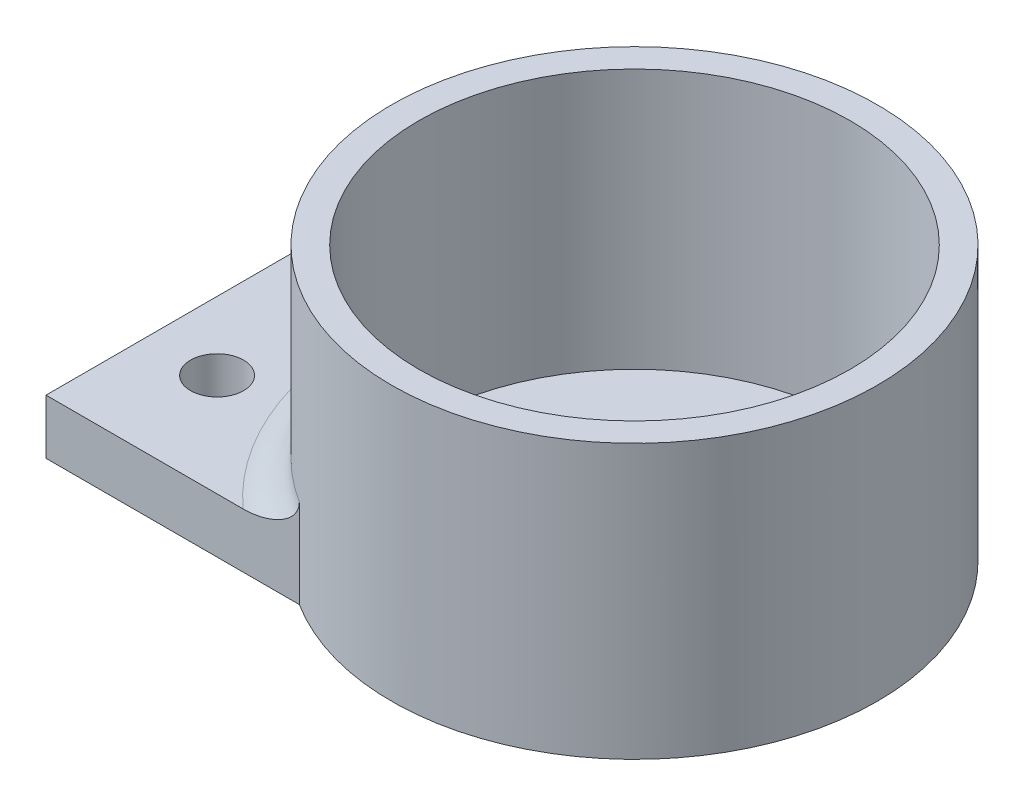
ISO-10303-21;
HEADER;
FILE_DESCRIPTION(('STEP AP214'),'2;1');
FILE_NAME('part.step','',(''),(''),'','','');
FILE_SCHEMA(('AUTOMOTIVE_DESIGN { 1 0 10303 214 1 1 1 1 }'));
ENDSEC;
DATA;
#1=APPLICATION_CONTEXT('core data for automotive mechanical design processes');
#2=APPLICATION_PROTOCOL_DEFINITION('international standard','automotive_design',2000,#1);
#3=PRODUCT_CONTEXT('',#1,'mechanical');
#4=PRODUCT('Part','Part','',(#3));
#5=PRODUCT_RELATED_PRODUCT_CATEGORY('part','',(#4));
#6=PRODUCT_DEFINITION_FORMATION('','',#4);
#7=PRODUCT_DEFINITION_CONTEXT('part definition',#1,'design');
#8=PRODUCT_DEFINITION('design','',#6,#7);
#9=PRODUCT_DEFINITION_SHAPE('','',#8);
#10=(LENGTH_UNIT() NAMED_UNIT(*) SI_UNIT(.MILLI.,.METRE.));
#11=(NAMED_UNIT(*) PLANE_ANGLE_UNIT() SI_UNIT($,.RADIAN.));
#12=(NAMED_UNIT(*) SI_UNIT($,.STERADIAN.) SOLID_ANGLE_UNIT());
#13=UNCERTAINTY_MEASURE_WITH_UNIT(LENGTH_MEASURE(1.E-05),#10,'distance_accuracy_value','');
#14=(GEOMETRIC_REPRESENTATION_CONTEXT(3) GLOBAL_UNCERTAINTY_ASSIGNED_CONTEXT((#13)) GLOBAL_UNIT_ASSIGNED_CONTEXT((#10,
#11,#12)) REPRESENTATION_CONTEXT('',''));
#15=CARTESIAN_POINT('',(0.,0.,0.));
#16=DIRECTION('',(0.,0.,1.));
#17=DIRECTION('',(1.,0.,0.));
#18=AXIS2_PLACEMENT_3D('',#15,#16,#17);
#19=CARTESIAN_POINT('',(0.,16.,0.));
#20=DIRECTION('',(0.,-1.,0.));
#21=DIRECTION('',(0.,0.,-1.));
#22=AXIS2_PLACEMENT_3D('',#19,#20,#21);
#23=CYLINDRICAL_SURFACE('',#22,12.6);
#24=CARTESIAN_POINT('',(0.,16.,0.));
#25=DIRECTION('',(0.,1.,0.));
#26=DIRECTION('',(0.,0.,1.));
#27=AXIS2_PLACEMENT_3D('',#24,#25,#26);
#28=CIRCLE('',#27,12.6);
#29=CARTESIAN_POINT('',(0.,16.,12.6));
#30=VERTEX_POINT('',#29);
#31=EDGE_CURVE('E124',#30,#30,#28,.T.);
#32=ORIENTED_EDGE('',*,*,#31,.T.);
#33=EDGE_LOOP('',(#32));
#34=FACE_BOUND('',#33,.T.);
#35=CARTESIAN_POINT('',(0.,0.8,0.));
#36=DIRECTION('',(0.,-1.,0.));
#37=DIRECTION('',(0.,0.,-1.));
#38=AXIS2_PLACEMENT_3D('',#35,#36,#37);
#39=CIRCLE('',#38,12.6);
#40=CARTESIAN_POINT('',(0.,0.8,-12.6));
#41=VERTEX_POINT('',#40);
#42=EDGE_CURVE('E175',#41,#41,#39,.T.);
#43=ORIENTED_EDGE('',*,*,#42,.T.);
#44=EDGE_LOOP('',(#43));
#45=FACE_BOUND('',#44,.T.);
#46=ADVANCED_FACE('F35',(#34,#45),#23,.F.);
#47=CARTESIAN_POINT('',(0.,16.,0.));
#48=DIRECTION('',(0.,-1.,0.));
#49=DIRECTION('',(0.,0.,-1.));
#50=AXIS2_PLACEMENT_3D('',#47,#48,#49);
#51=CYLINDRICAL_SURFACE('',#50,14.2);
#52=CARTESIAN_POINT('',(0.,16.,0.));
#53=DIRECTION('',(0.,1.,0.));
#54=DIRECTION('',(0.,0.,1.));
#55=AXIS2_PLACEMENT_3D('',#52,#53,#54);
#56=CIRCLE('',#55,14.2);
#57=CARTESIAN_POINT('',(0.,16.,14.2));
#58=VERTEX_POINT('',#57);
#59=EDGE_CURVE('E130',#58,#58,#56,.T.);
#60=ORIENTED_EDGE('',*,*,#59,.F.);
#61=EDGE_LOOP('',(#60));
#62=FACE_BOUND('',#61,.T.);
#63=DIRECTION('',(0.,-1.,0.));
#64=VECTOR('',#63,1.);
#65=CARTESIAN_POINT('',(-7.59210115844093,3.2,-12.));
#66=LINE('',#65,#64);
#67=CARTESIAN_POINT('',(-7.59210115844093,5.2,-12.));
#68=VERTEX_POINT('',#67);
#69=CARTESIAN_POINT('',(-7.59210115844093,0.,-12.));
#70=VERTEX_POINT('',#69);
#71=EDGE_CURVE('E55',#68,#70,#66,.T.);
#72=ORIENTED_EDGE('',*,*,#71,.F.);
#73=CARTESIAN_POINT('',(0.,5.2,0.));
#74=DIRECTION('',(0.,-1.,0.));
#75=DIRECTION('',(0.,0.,-1.));
#76=AXIS2_PLACEMENT_3D('',#73,#74,#75);
#77=CIRCLE('',#76,14.2);
#78=CARTESIAN_POINT('',(-7.59210115844093,5.2,12.));
#79=VERTEX_POINT('',#78);
#80=EDGE_CURVE('E141',#68,#79,#77,.F.);
#81=ORIENTED_EDGE('',*,*,#80,.T.);
#82=DIRECTION('',(0.,-1.,0.));
#83=VECTOR('',#82,1.);
#84=CARTESIAN_POINT('',(-7.59210115844093,3.2,12.));
#85=LINE('',#84,#83);
#86=CARTESIAN_POINT('',(-7.59210115844093,0.,12.));
#87=VERTEX_POINT('',#86);
#88=EDGE_CURVE('E62',#79,#87,#85,.T.);
#89=ORIENTED_EDGE('',*,*,#88,.T.);
#90=CARTESIAN_POINT('',(0.,0.,0.));
#91=DIRECTION('',(0.,1.,0.));
#92=DIRECTION('',(0.,0.,1.));
#93=AXIS2_PLACEMENT_3D('',#90,#91,#92);
#94=CIRCLE('',#93,14.2);
#95=EDGE_CURVE('E129',#87,#70,#94,.T.);
#96=ORIENTED_EDGE('',*,*,#95,.T.);
#97=EDGE_LOOP('',(#72,#81,#89,#96));
#98=FACE_BOUND('',#97,.T.);
#99=ADVANCED_FACE('F157',(#62,#98),#51,.T.);
#100=CARTESIAN_POINT('',(0.,16.,0.));
#101=DIRECTION('',(0.,1.,0.));
#102=DIRECTION('',(0.,0.,1.));
#103=AXIS2_PLACEMENT_3D('',#100,#101,#102);
#104=PLANE('',#103);
#105=ORIENTED_EDGE('',*,*,#59,.T.);
#106=EDGE_LOOP('',(#105));
#107=FACE_BOUND('',#106,.T.);
#108=ORIENTED_EDGE('',*,*,#31,.F.);
#109=EDGE_LOOP('',(#108));
#110=FACE_BOUND('',#109,.T.);
#111=ADVANCED_FACE('F159',(#107,#110),#104,.T.);
#112=CARTESIAN_POINT('',(0.,0.,0.));
#113=DIRECTION('',(0.,1.,0.));
#114=DIRECTION('',(0.,0.,1.));
#115=AXIS2_PLACEMENT_3D('',#112,#113,#114);
#116=PLANE('',#115);
#117=CARTESIAN_POINT('',(-18.4,0.,6.));
#118=DIRECTION('',(0.,-1.,0.));
#119=DIRECTION('',(0.,0.,-1.));
#120=AXIS2_PLACEMENT_3D('',#117,#118,#119);
#121=CIRCLE('',#120,1.55);
#122=CARTESIAN_POINT('',(-18.4,0.,4.45));
#123=VERTEX_POINT('',#122);
#124=EDGE_CURVE('E139',#123,#123,#121,.T.);
#125=ORIENTED_EDGE('',*,*,#124,.F.);
#126=EDGE_LOOP('',(#125));
#127=FACE_BOUND('',#126,.T.);
#128=CARTESIAN_POINT('',(-18.4,0.,-6.));
#129=DIRECTION('',(0.,-1.,0.));
#130=DIRECTION('',(0.,0.,-1.));
#131=AXIS2_PLACEMENT_3D('',#128,#129,#130);
#132=CIRCLE('',#131,1.55);
#133=CARTESIAN_POINT('',(-18.4,0.,-7.55));
#134=VERTEX_POINT('',#133);
#135=EDGE_CURVE('E115',#134,#134,#132,.T.);
#136=ORIENTED_EDGE('',*,*,#135,.F.);
#137=EDGE_LOOP('',(#136));
#138=FACE_BOUND('',#137,.T.);
#139=ORIENTED_EDGE('',*,*,#95,.F.);
#140=DIRECTION('',(1.,0.,0.));
#141=VECTOR('',#140,1.);
#142=CARTESIAN_POINT('',(0.,0.,12.));
#143=LINE('',#142,#141);
#144=CARTESIAN_POINT('',(-22.4,0.,12.));
#145=VERTEX_POINT('',#144);
#146=EDGE_CURVE('E111',#145,#87,#143,.T.);
#147=ORIENTED_EDGE('',*,*,#146,.F.);
#148=DIRECTION('',(0.,0.,-1.));
#149=VECTOR('',#148,1.);
#150=CARTESIAN_POINT('',(-22.4,0.,0.));
#151=LINE('',#150,#149);
#152=CARTESIAN_POINT('',(-22.4,0.,-12.));
#153=VERTEX_POINT('',#152);
#154=EDGE_CURVE('E119',#145,#153,#151,.T.);
#155=ORIENTED_EDGE('',*,*,#154,.T.);
#156=DIRECTION('',(1.,0.,0.));
#157=VECTOR('',#156,1.);
#158=CARTESIAN_POINT('',(0.,0.,-12.));
#159=LINE('',#158,#157);
#160=EDGE_CURVE('E92',#153,#70,#159,.T.);
#161=ORIENTED_EDGE('',*,*,#160,.T.);
#162=EDGE_LOOP('',(#139,#147,#155,#161));
#163=FACE_BOUND('',#162,.T.);
#164=CARTESIAN_POINT('',(0.,0.,0.));
#165=DIRECTION('',(0.,-1.,0.));
#166=DIRECTION('',(0.,0.,-1.));
#167=AXIS2_PLACEMENT_3D('',#164,#165,#166);
#168=CIRCLE('',#167,3.8);
#169=CARTESIAN_POINT('',(0.,0.,-3.8));
#170=VERTEX_POINT('',#169);
#171=EDGE_CURVE('E181',#170,#170,#168,.T.);
#172=ORIENTED_EDGE('',*,*,#171,.F.);
#173=EDGE_LOOP('',(#172));
#174=FACE_BOUND('',#173,.T.);
#175=ADVANCED_FACE('F154',(#127,#138,#163,#174),#116,.F.);
#176=CARTESIAN_POINT('',(-22.4,3.2,0.));
#177=DIRECTION('',(-1.,0.,0.));
#178=DIRECTION('',(0.,0.,1.));
#179=AXIS2_PLACEMENT_3D('',#176,#177,#178);
#180=PLANE('',#179);
#181=ORIENTED_EDGE('',*,*,#154,.F.);
#182=DIRECTION('',(0.,-1.,0.));
#183=VECTOR('',#182,1.);
#184=CARTESIAN_POINT('',(-22.4,3.2,12.));
#185=LINE('',#184,#183);
#186=CARTESIAN_POINT('',(-22.4,3.2,12.));
#187=VERTEX_POINT('',#186);
#188=EDGE_CURVE('E109',#187,#145,#185,.T.);
#189=ORIENTED_EDGE('',*,*,#188,.F.);
#190=DIRECTION('',(0.,0.,-1.));
#191=VECTOR('',#190,1.);
#192=CARTESIAN_POINT('',(-22.4,3.2,0.));
#193=LINE('',#192,#191);
#194=CARTESIAN_POINT('',(-22.4,3.2,-12.));
#195=VERTEX_POINT('',#194);
#196=EDGE_CURVE('E104',#187,#195,#193,.T.);
#197=ORIENTED_EDGE('',*,*,#196,.T.);
#198=DIRECTION('',(0.,-1.,0.));
#199=VECTOR('',#198,1.);
#200=CARTESIAN_POINT('',(-22.4,3.2,-12.));
#201=LINE('',#200,#199);
#202=EDGE_CURVE('E87',#195,#153,#201,.T.);
#203=ORIENTED_EDGE('',*,*,#202,.T.);
#204=EDGE_LOOP('',(#181,#189,#197,#203));
#205=FACE_BOUND('',#204,.T.);
#206=ADVANCED_FACE('F108',(#205),#180,.T.);
#207=CARTESIAN_POINT('',(0.,3.2,12.));
#208=DIRECTION('',(0.,0.,-1.));
#209=DIRECTION('',(-1.,0.,0.));
#210=AXIS2_PLACEMENT_3D('',#207,#208,#209);
#211=PLANE('',#210);
#212=ORIENTED_EDGE('',*,*,#146,.T.);
#213=ORIENTED_EDGE('',*,*,#88,.F.);
#214=CARTESIAN_POINT('',(-7.59210115844093,5.2,12.));
#215=CARTESIAN_POINT('',(-7.592091586476,5.1674907517451,12.));
#216=CARTESIAN_POINT('',(-7.59358472526516,5.1349990568144,12.));
#217=CARTESIAN_POINT('',(-7.59948236105787,5.07031610765808,12.));
#218=CARTESIAN_POINT('',(-7.60388364184017,5.03812456132676,12.));
#219=CARTESIAN_POINT('',(-7.62117971545354,4.94302771261602,12.));
#220=CARTESIAN_POINT('',(-7.63817153133713,4.88083921766464,12.));
#221=CARTESIAN_POINT('',(-7.68704338768166,4.74478440607469,12.));
#222=CARTESIAN_POINT('',(-7.72158651420703,4.67189460870396,12.));
#223=CARTESIAN_POINT('',(-7.80200128612696,4.53240676871077,12.));
#224=CARTESIAN_POINT('',(-7.84792617011265,4.46584038828011,12.));
#225=CARTESIAN_POINT('',(-7.97592011352488,4.30396090733096,12.));
#226=CARTESIAN_POINT('',(-8.06385833641699,4.21333330304286,12.));
#227=CARTESIAN_POINT('',(-8.25214358590425,4.04619954543277,12.));
#228=CARTESIAN_POINT('',(-8.35251701096455,3.96972432419483,12.));
#229=CARTESIAN_POINT('',(-8.54502554617771,3.8401884859509,12.));
#230=CARTESIAN_POINT('',(-8.63597537511568,3.78533693476471,12.));
#231=CARTESIAN_POINT('',(-8.82225966456421,3.68357238123239,12.));
#232=CARTESIAN_POINT('',(-8.91759695939213,3.63666460480407,12.));
#233=CARTESIAN_POINT('',(-9.1117120035958,3.55021476207558,12.));
#234=CARTESIAN_POINT('',(-9.21049491643555,3.5106843682619,12.));
#235=CARTESIAN_POINT('',(-9.4106253428973,3.4387497702227,12.));
#236=CARTESIAN_POINT('',(-9.51197317193242,3.40634644722275,12.));
#237=CARTESIAN_POINT('',(-9.71774595834552,3.34820839586359,12.));
#238=CARTESIAN_POINT('',(-9.82219235814489,3.32254972319131,12.));
#239=CARTESIAN_POINT('',(-10.0325812364247,3.27836302791032,12.));
#240=CARTESIAN_POINT('',(-10.1385237177011,3.25983501862917,12.));
#241=CARTESIAN_POINT('',(-10.3506319126569,3.2301374043945,12.));
#242=CARTESIAN_POINT('',(-10.4567900334942,3.21891381269759,12.));
#243=CARTESIAN_POINT('',(-10.6696307826768,3.20385383900649,12.));
#244=CARTESIAN_POINT('',(-10.7763134318927,3.20001775338188,12.));
#245=CARTESIAN_POINT('',(-10.8830142883302,3.2,12.));
#246=B_SPLINE_CURVE_WITH_KNOTS('',3,(#214,#215,#216,#217,#218,#219,#220,#221,#222,#223,#224,
#225,#226,#227,#228,#229,#230,#231,#232,#233,#234,#235,#236,#237,#238,#239,#240,#241,#242,#243,
#244,#245),.UNSPECIFIED.,.F.,.F.,(4,2,2,2,2,2,2,2,2,2,2,2,2,2,2,4),(0.,0.097461196912407,
0.194814787905074,0.38727189518514,0.627934270707473,0.869744332528464,1.24648330210409,
1.62403620743147,1.94223889219939,2.26065010442246,2.57956091280387,2.89851113072388,
3.22091706191048,3.54332359568632,3.86331932405566,4.18332788964261),.UNSPECIFIED.);
#247=CARTESIAN_POINT('',(-10.8830142883302,3.2,12.));
#248=VERTEX_POINT('',#247);
#249=EDGE_CURVE('E11',#79,#248,#246,.T.);
#250=ORIENTED_EDGE('',*,*,#249,.T.);
#251=DIRECTION('',(1.,0.,0.));
#252=VECTOR('',#251,1.);
#253=CARTESIAN_POINT('',(0.,3.2,12.));
#254=LINE('',#253,#252);
#255=EDGE_CURVE('E97',#187,#248,#254,.T.);
#256=ORIENTED_EDGE('',*,*,#255,.F.);
#257=ORIENTED_EDGE('',*,*,#188,.T.);
#258=EDGE_LOOP('',(#212,#213,#250,#256,#257));
#259=FACE_BOUND('',#258,.T.);
#260=ADVANCED_FACE('F149',(#259),#211,.F.);
#261=CARTESIAN_POINT('',(0.,3.2,-12.));
#262=DIRECTION('',(0.,0.,-1.));
#263=DIRECTION('',(-1.,0.,0.));
#264=AXIS2_PLACEMENT_3D('',#261,#262,#263);
#265=PLANE('',#264);
#266=ORIENTED_EDGE('',*,*,#160,.F.);
#267=ORIENTED_EDGE('',*,*,#202,.F.);
#268=DIRECTION('',(1.,0.,0.));
#269=VECTOR('',#268,1.);
#270=CARTESIAN_POINT('',(0.,3.2,-12.));
#271=LINE('',#270,#269);
#272=CARTESIAN_POINT('',(-10.8830142883302,3.2,-12.));
#273=VERTEX_POINT('',#272);
#274=EDGE_CURVE('E90',#195,#273,#271,.T.);
#275=ORIENTED_EDGE('',*,*,#274,.T.);
#276=CARTESIAN_POINT('',(-10.8830142883302,3.2,-12.));
#277=CARTESIAN_POINT('',(-10.7528857031162,3.20003980854857,-12.));
#278=CARTESIAN_POINT('',(-10.622790420267,3.20573228934252,-12.));
#279=CARTESIAN_POINT('',(-10.3634686350885,3.22802964705193,-12.));
#280=CARTESIAN_POINT('',(-10.2342425968111,3.24463994747906,-12.));
#281=CARTESIAN_POINT('',(-9.97623712132293,3.28861016920733,-12.));
#282=CARTESIAN_POINT('',(-9.84747681934114,3.31608178258652,-12.));
#283=CARTESIAN_POINT('',(-9.59272267504356,3.38166956867727,-12.));
#284=CARTESIAN_POINT('',(-9.46672785183967,3.41978189920605,-12.));
#285=CARTESIAN_POINT('',(-9.25547354959596,3.49391017042378,-12.));
#286=CARTESIAN_POINT('',(-9.16924274434022,3.52717894722871,-12.));
#287=CARTESIAN_POINT('',(-8.99914195760728,3.59927152159044,-12.));
#288=CARTESIAN_POINT('',(-8.91527146046996,3.63809409434757,-12.));
#289=CARTESIAN_POINT('',(-8.75075067453522,3.7214755531616,-12.));
#290=CARTESIAN_POINT('',(-8.67009098008453,3.76601577503318,-12.));
#291=CARTESIAN_POINT('',(-8.51259315097185,3.86135629845671,-12.));
#292=CARTESIAN_POINT('',(-8.43575299449151,3.91215323749149,-12.));
#293=CARTESIAN_POINT('',(-8.27646095677758,4.02835621385637,-12.));
#294=CARTESIAN_POINT('',(-8.1947643504757,4.09481250303222,-12.));
#295=CARTESIAN_POINT('',(-8.04061278769122,4.23788734401878,-12.));
#296=CARTESIAN_POINT('',(-7.96815398407959,4.31450163818133,-12.));
#297=CARTESIAN_POINT('',(-7.85325803770196,4.45860061221691,-12.));
#298=CARTESIAN_POINT('',(-7.8078255985535,4.52366905987423,-12.));
#299=CARTESIAN_POINT('',(-7.72780547552511,4.65994291743418,-12.));
#300=CARTESIAN_POINT('',(-7.69317070636513,4.73111990566161,-12.));
#301=CARTESIAN_POINT('',(-7.64208134415011,4.86767456055213,-12.));
#302=CARTESIAN_POINT('',(-7.62366907675984,4.93230058487382,-12.));
#303=CARTESIAN_POINT('',(-7.60490424581767,5.03127142153448,-12.));
#304=CARTESIAN_POINT('',(-7.60012342714198,5.06480862795305,-12.));
#305=CARTESIAN_POINT('',(-7.59371435100395,5.13222345127305,-12.));
#306=CARTESIAN_POINT('',(-7.59208999273108,5.16610143730628,-12.));
#307=CARTESIAN_POINT('',(-7.59210115844092,5.2,-12.));
#308=B_SPLINE_CURVE_WITH_KNOTS('',3,(#276,#277,#278,#279,#280,#281,#282,#283,#284,#285,#286,
#287,#288,#289,#290,#291,#292,#293,#294,#295,#296,#297,#298,#299,#300,#301,#302,#303,#304,#305,
#306,#307),.UNSPECIFIED.,.F.,.F.,(4,2,2,2,2,2,2,2,2,2,2,2,2,2,2,4),(0.,0.390217728880545,
0.7806294480965,1.1751649796666,1.56955823497314,1.84666434103392,2.12370942977431,
2.39987212052893,2.67588703683665,2.99114260045318,3.30626644244524,3.54358668553246,
3.77985708576338,3.98038400597982,4.08187782517218,4.18349694062465),.UNSPECIFIED.);
#309=EDGE_CURVE('E48',#273,#68,#308,.T.);
#310=ORIENTED_EDGE('',*,*,#309,.T.);
#311=ORIENTED_EDGE('',*,*,#71,.T.);
#312=EDGE_LOOP('',(#266,#267,#275,#310,#311));
#313=FACE_BOUND('',#312,.T.);
#314=ADVANCED_FACE('F89',(#313),#265,.T.);
#315=CARTESIAN_POINT('',(0.,3.2,0.));
#316=DIRECTION('',(0.,-1.,0.));
#317=DIRECTION('',(0.,0.,-1.));
#318=AXIS2_PLACEMENT_3D('',#315,#316,#317);
#319=PLANE('',#318);
#320=CARTESIAN_POINT('',(-18.4,3.2,6.));
#321=DIRECTION('',(0.,-1.,0.));
#322=DIRECTION('',(0.,0.,-1.));
#323=AXIS2_PLACEMENT_3D('',#320,#321,#322);
#324=CIRCLE('',#323,1.55);
#325=CARTESIAN_POINT('',(-18.4,3.2,4.45));
#326=VERTEX_POINT('',#325);
#327=EDGE_CURVE('E136',#326,#326,#324,.T.);
#328=ORIENTED_EDGE('',*,*,#327,.T.);
#329=EDGE_LOOP('',(#328));
#330=FACE_BOUND('',#329,.T.);
#331=CARTESIAN_POINT('',(-18.4,3.2,-6.));
#332=DIRECTION('',(0.,-1.,0.));
#333=DIRECTION('',(0.,0.,-1.));
#334=AXIS2_PLACEMENT_3D('',#331,#332,#333);
#335=CIRCLE('',#334,1.55);
#336=CARTESIAN_POINT('',(-18.4,3.2,-7.55));
#337=VERTEX_POINT('',#336);
#338=EDGE_CURVE('E121',#337,#337,#335,.T.);
#339=ORIENTED_EDGE('',*,*,#338,.T.);
#340=EDGE_LOOP('',(#339));
#341=FACE_BOUND('',#340,.T.);
#342=ORIENTED_EDGE('',*,*,#255,.T.);
#343=CARTESIAN_POINT('',(0.,3.2,0.));
#344=DIRECTION('',(0.,-1.,0.));
#345=DIRECTION('',(0.,0.,-1.));
#346=AXIS2_PLACEMENT_3D('',#343,#344,#345);
#347=CIRCLE('',#346,16.2);
#348=EDGE_CURVE('E106',#248,#273,#347,.T.);
#349=ORIENTED_EDGE('',*,*,#348,.T.);
#350=ORIENTED_EDGE('',*,*,#274,.F.);
#351=ORIENTED_EDGE('',*,*,#196,.F.);
#352=EDGE_LOOP('',(#342,#349,#350,#351));
#353=FACE_BOUND('',#352,.T.);
#354=ADVANCED_FACE('F103',(#330,#341,#353),#319,.F.);
#355=CARTESIAN_POINT('',(-18.4,10.,-6.));
#356=DIRECTION('',(0.,-1.,0.));
#357=DIRECTION('',(0.,0.,-1.));
#358=AXIS2_PLACEMENT_3D('',#355,#356,#357);
#359=CYLINDRICAL_SURFACE('',#358,1.55);
#360=ORIENTED_EDGE('',*,*,#135,.T.);
#361=EDGE_LOOP('',(#360));
#362=FACE_BOUND('',#361,.T.);
#363=ORIENTED_EDGE('',*,*,#338,.F.);
#364=EDGE_LOOP('',(#363));
#365=FACE_BOUND('',#364,.T.);
#366=ADVANCED_FACE('F203',(#362,#365),#359,.F.);
#367=CARTESIAN_POINT('',(-18.4,10.,6.));
#368=DIRECTION('',(0.,-1.,0.));
#369=DIRECTION('',(0.,0.,-1.));
#370=AXIS2_PLACEMENT_3D('',#367,#368,#369);
#371=CYLINDRICAL_SURFACE('',#370,1.55);
#372=ORIENTED_EDGE('',*,*,#124,.T.);
#373=EDGE_LOOP('',(#372));
#374=FACE_BOUND('',#373,.T.);
#375=ORIENTED_EDGE('',*,*,#327,.F.);
#376=EDGE_LOOP('',(#375));
#377=FACE_BOUND('',#376,.T.);
#378=ADVANCED_FACE('F200',(#374,#377),#371,.F.);
#379=CARTESIAN_POINT('',(0.,5.2,0.));
#380=DIRECTION('',(0.,-1.,0.));
#381=DIRECTION('',(0.,0.,-1.));
#382=AXIS2_PLACEMENT_3D('',#379,#380,#381);
#383=TOROIDAL_SURFACE('',#382,16.2,2.);
#384=ORIENTED_EDGE('',*,*,#249,.F.);
#385=ORIENTED_EDGE('',*,*,#80,.F.);
#386=ORIENTED_EDGE('',*,*,#309,.F.);
#387=ORIENTED_EDGE('',*,*,#348,.F.);
#388=EDGE_LOOP('',(#384,#385,#386,#387));
#389=FACE_BOUND('',#388,.T.);
#390=ADVANCED_FACE('F37',(#389),#383,.F.);
#391=CARTESIAN_POINT('',(0.,0.8,0.));
#392=DIRECTION('',(0.,-1.,0.));
#393=DIRECTION('',(0.,0.,-1.));
#394=AXIS2_PLACEMENT_3D('',#391,#392,#393);
#395=PLANE('',#394);
#396=CARTESIAN_POINT('',(0.,0.8,0.));
#397=DIRECTION('',(0.,-1.,0.));
#398=DIRECTION('',(0.,0.,-1.));
#399=AXIS2_PLACEMENT_3D('',#396,#397,#398);
#400=CIRCLE('',#399,3.8);
#401=CARTESIAN_POINT('',(0.,0.8,-3.8));
#402=VERTEX_POINT('',#401);
#403=EDGE_CURVE('E177',#402,#402,#400,.T.);
#404=ORIENTED_EDGE('',*,*,#403,.T.);
#405=EDGE_LOOP('',(#404));
#406=FACE_BOUND('',#405,.T.);
#407=ORIENTED_EDGE('',*,*,#42,.F.);
#408=EDGE_LOOP('',(#407));
#409=FACE_BOUND('',#408,.T.);
#410=ADVANCED_FACE('F190',(#406,#409),#395,.F.);
#411=CARTESIAN_POINT('',(0.,0.8,0.));
#412=DIRECTION('',(0.,-1.,0.));
#413=DIRECTION('',(0.,0.,-1.));
#414=AXIS2_PLACEMENT_3D('',#411,#412,#413);
#415=CYLINDRICAL_SURFACE('',#414,3.8);
#416=ORIENTED_EDGE('',*,*,#403,.F.);
#417=EDGE_LOOP('',(#416));
#418=FACE_BOUND('',#417,.T.);
#419=ORIENTED_EDGE('',*,*,#171,.T.);
#420=EDGE_LOOP('',(#419));
#421=FACE_BOUND('',#420,.T.);
#422=ADVANCED_FACE('F187',(#418,#421),#415,.F.);
#423=CLOSED_SHELL('',(#46,#99,#111,#175,#206,#260,#314,#354,#366,#378,#390,#410,#422));
#424=MANIFOLD_SOLID_BREP('B2',#423);
#425=ADVANCED_BREP_SHAPE_REPRESENTATION('',(#18,#424),#14);
#426=SHAPE_DEFINITION_REPRESENTATION(#9,#425);
ENDSEC;
END-ISO-10303-21;
